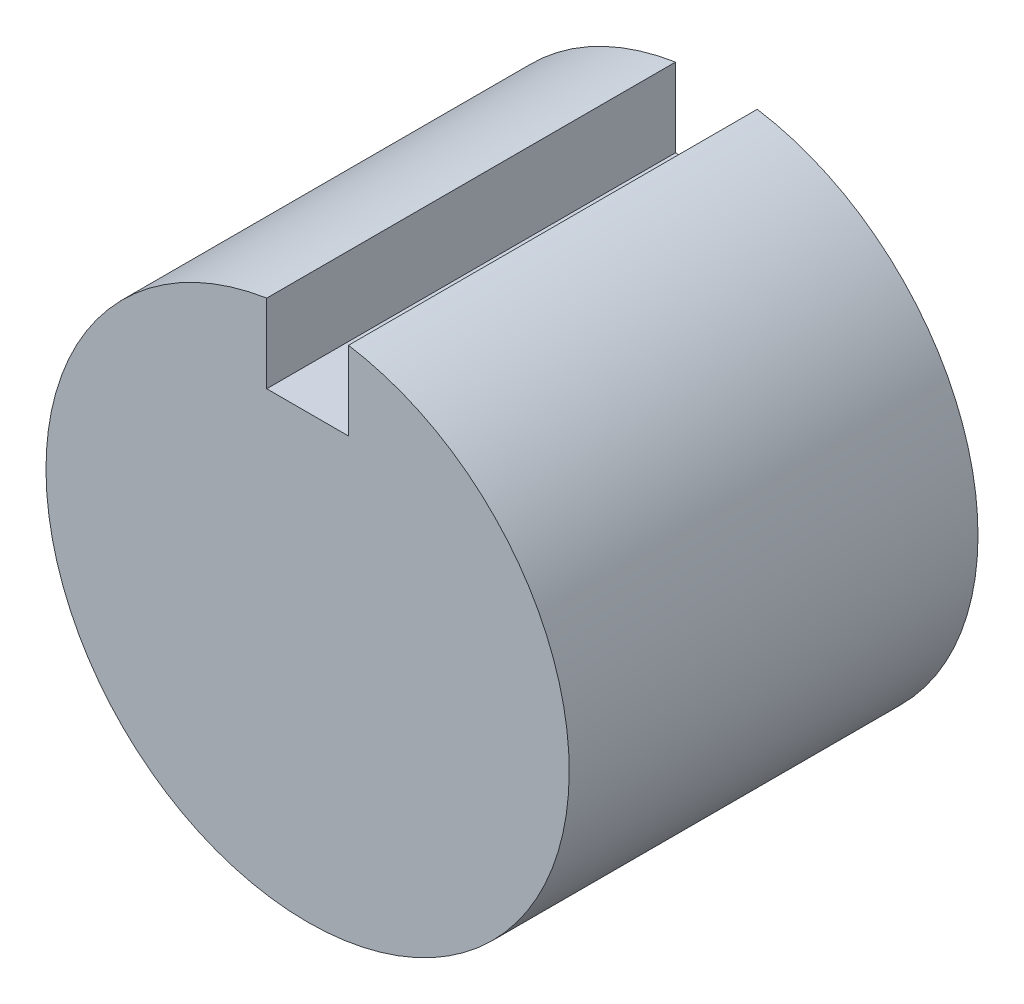
ISO-10303-21;
HEADER;
FILE_DESCRIPTION(('STEP AP214'),'2;1');
FILE_NAME('part.step','',(''),(''),'','','');
FILE_SCHEMA(('AUTOMOTIVE_DESIGN { 1 0 10303 214 1 1 1 1 }'));
ENDSEC;
DATA;
#1=APPLICATION_CONTEXT('core data for automotive mechanical design processes');
#2=APPLICATION_PROTOCOL_DEFINITION('international standard','automotive_design',2000,#1);
#3=PRODUCT_CONTEXT('',#1,'mechanical');
#4=PRODUCT('Part','Part','',(#3));
#5=PRODUCT_RELATED_PRODUCT_CATEGORY('part','',(#4));
#6=PRODUCT_DEFINITION_FORMATION('','',#4);
#7=PRODUCT_DEFINITION_CONTEXT('part definition',#1,'design');
#8=PRODUCT_DEFINITION('design','',#6,#7);
#9=PRODUCT_DEFINITION_SHAPE('','',#8);
#10=(LENGTH_UNIT() NAMED_UNIT(*) SI_UNIT(.MILLI.,.METRE.));
#11=(NAMED_UNIT(*) PLANE_ANGLE_UNIT() SI_UNIT($,.RADIAN.));
#12=(NAMED_UNIT(*) SI_UNIT($,.STERADIAN.) SOLID_ANGLE_UNIT());
#13=UNCERTAINTY_MEASURE_WITH_UNIT(LENGTH_MEASURE(1.E-05),#10,'distance_accuracy_value','');
#14=(GEOMETRIC_REPRESENTATION_CONTEXT(3) GLOBAL_UNCERTAINTY_ASSIGNED_CONTEXT((#13)) GLOBAL_UNIT_ASSIGNED_CONTEXT((#10,
#11,#12)) REPRESENTATION_CONTEXT('',''));
#15=CARTESIAN_POINT('',(0.,0.,0.));
#16=DIRECTION('',(0.,0.,1.));
#17=DIRECTION('',(1.,0.,0.));
#18=AXIS2_PLACEMENT_3D('',#15,#16,#17);
#19=CARTESIAN_POINT('',(0.,0.,10.));
#20=DIRECTION('',(0.,0.,-1.));
#21=DIRECTION('',(-1.,0.,0.));
#22=AXIS2_PLACEMENT_3D('',#19,#20,#21);
#23=CYLINDRICAL_SURFACE('',#22,6.4);
#24=DIRECTION('',(0.,0.,1.));
#25=VECTOR('',#24,1.);
#26=CARTESIAN_POINT('',(-1.,6.32139225171164,-38.3505319094211));
#27=LINE('',#26,#25);
#28=CARTESIAN_POINT('',(-1.,6.32139225171164,0.));
#29=VERTEX_POINT('',#28);
#30=CARTESIAN_POINT('',(-1.,6.32139225171164,10.));
#31=VERTEX_POINT('',#30);
#32=EDGE_CURVE('E91',#29,#31,#27,.T.);
#33=ORIENTED_EDGE('',*,*,#32,.F.);
#34=CARTESIAN_POINT('',(0.,0.,0.));
#35=DIRECTION('',(0.,0.,1.));
#36=DIRECTION('',(1.,0.,0.));
#37=AXIS2_PLACEMENT_3D('',#34,#35,#36);
#38=CIRCLE('',#37,6.4);
#39=CARTESIAN_POINT('',(1.,6.32139225171164,0.));
#40=VERTEX_POINT('',#39);
#41=EDGE_CURVE('E36',#29,#40,#38,.T.);
#42=ORIENTED_EDGE('',*,*,#41,.T.);
#43=DIRECTION('',(0.,0.,1.));
#44=VECTOR('',#43,1.);
#45=CARTESIAN_POINT('',(1.,6.32139225171164,-38.3505319094211));
#46=LINE('',#45,#44);
#47=CARTESIAN_POINT('',(1.,6.32139225171164,10.));
#48=VERTEX_POINT('',#47);
#49=EDGE_CURVE('E88',#40,#48,#46,.T.);
#50=ORIENTED_EDGE('',*,*,#49,.T.);
#51=CARTESIAN_POINT('',(0.,0.,10.));
#52=DIRECTION('',(0.,0.,1.));
#53=DIRECTION('',(1.,0.,0.));
#54=AXIS2_PLACEMENT_3D('',#51,#52,#53);
#55=CIRCLE('',#54,6.4);
#56=EDGE_CURVE('E11',#31,#48,#55,.T.);
#57=ORIENTED_EDGE('',*,*,#56,.F.);
#58=EDGE_LOOP('',(#33,#42,#50,#57));
#59=FACE_BOUND('',#58,.T.);
#60=ADVANCED_FACE('F33',(#59),#23,.T.);
#61=CARTESIAN_POINT('',(0.,0.,0.));
#62=DIRECTION('',(0.,0.,1.));
#63=DIRECTION('',(1.,0.,0.));
#64=AXIS2_PLACEMENT_3D('',#61,#62,#63);
#65=PLANE('',#64);
#66=DIRECTION('',(0.,-1.,0.));
#67=VECTOR('',#66,1.);
#68=CARTESIAN_POINT('',(-1.,4.4,0.));
#69=LINE('',#68,#67);
#70=CARTESIAN_POINT('',(-1.,4.4,0.));
#71=VERTEX_POINT('',#70);
#72=EDGE_CURVE('E77',#29,#71,#69,.T.);
#73=ORIENTED_EDGE('',*,*,#72,.T.);
#74=DIRECTION('',(1.,0.,0.));
#75=VECTOR('',#74,1.);
#76=CARTESIAN_POINT('',(-1.,4.4,0.));
#77=LINE('',#76,#75);
#78=CARTESIAN_POINT('',(1.,4.4,0.));
#79=VERTEX_POINT('',#78);
#80=EDGE_CURVE('E70',#71,#79,#77,.T.);
#81=ORIENTED_EDGE('',*,*,#80,.T.);
#82=DIRECTION('',(0.,1.,0.));
#83=VECTOR('',#82,1.);
#84=CARTESIAN_POINT('',(1.,4.4,0.));
#85=LINE('',#84,#83);
#86=EDGE_CURVE('E74',#79,#40,#85,.T.);
#87=ORIENTED_EDGE('',*,*,#86,.T.);
#88=ORIENTED_EDGE('',*,*,#41,.F.);
#89=EDGE_LOOP('',(#73,#81,#87,#88));
#90=FACE_BOUND('',#89,.T.);
#91=ADVANCED_FACE('F72',(#90),#65,.F.);
#92=CARTESIAN_POINT('',(0.,0.,10.));
#93=DIRECTION('',(0.,0.,1.));
#94=DIRECTION('',(1.,0.,0.));
#95=AXIS2_PLACEMENT_3D('',#92,#93,#94);
#96=PLANE('',#95);
#97=DIRECTION('',(0.,1.,0.));
#98=VECTOR('',#97,1.);
#99=CARTESIAN_POINT('',(1.,4.4,10.));
#100=LINE('',#99,#98);
#101=CARTESIAN_POINT('',(1.,4.4,9.99999999999999));
#102=VERTEX_POINT('',#101);
#103=EDGE_CURVE('E46',#102,#48,#100,.T.);
#104=ORIENTED_EDGE('',*,*,#103,.F.);
#105=DIRECTION('',(1.,0.,0.));
#106=VECTOR('',#105,1.);
#107=CARTESIAN_POINT('',(-1.,4.4,10.));
#108=LINE('',#107,#106);
#109=CARTESIAN_POINT('',(-1.,4.4,9.99999999999999));
#110=VERTEX_POINT('',#109);
#111=EDGE_CURVE('E50',#110,#102,#108,.T.);
#112=ORIENTED_EDGE('',*,*,#111,.F.);
#113=DIRECTION('',(0.,-1.,0.));
#114=VECTOR('',#113,1.);
#115=CARTESIAN_POINT('',(-1.,4.4,10.));
#116=LINE('',#115,#114);
#117=EDGE_CURVE('E96',#31,#110,#116,.T.);
#118=ORIENTED_EDGE('',*,*,#117,.F.);
#119=ORIENTED_EDGE('',*,*,#56,.T.);
#120=EDGE_LOOP('',(#104,#112,#118,#119));
#121=FACE_BOUND('',#120,.T.);
#122=ADVANCED_FACE('F107',(#121),#96,.T.);
#123=CARTESIAN_POINT('',(-1.,4.4,-38.3505319094211));
#124=DIRECTION('',(1.,0.,0.));
#125=DIRECTION('',(0.,0.,-1.));
#126=AXIS2_PLACEMENT_3D('',#123,#124,#125);
#127=PLANE('',#126);
#128=ORIENTED_EDGE('',*,*,#72,.F.);
#129=ORIENTED_EDGE('',*,*,#32,.T.);
#130=ORIENTED_EDGE('',*,*,#117,.T.);
#131=DIRECTION('',(0.,0.,1.));
#132=VECTOR('',#131,1.);
#133=CARTESIAN_POINT('',(-1.,4.4,-38.3505319094211));
#134=LINE('',#133,#132);
#135=EDGE_CURVE('E94',#71,#110,#134,.T.);
#136=ORIENTED_EDGE('',*,*,#135,.F.);
#137=EDGE_LOOP('',(#128,#129,#130,#136));
#138=FACE_BOUND('',#137,.T.);
#139=ADVANCED_FACE('F102',(#138),#127,.T.);
#140=CARTESIAN_POINT('',(-1.,4.4,-38.3505319094211));
#141=DIRECTION('',(0.,1.,0.));
#142=DIRECTION('',(-1.,0.,0.));
#143=AXIS2_PLACEMENT_3D('',#140,#141,#142);
#144=PLANE('',#143);
#145=ORIENTED_EDGE('',*,*,#80,.F.);
#146=ORIENTED_EDGE('',*,*,#135,.T.);
#147=ORIENTED_EDGE('',*,*,#111,.T.);
#148=DIRECTION('',(0.,0.,1.));
#149=VECTOR('',#148,1.);
#150=CARTESIAN_POINT('',(1.,4.4,-38.3505319094211));
#151=LINE('',#150,#149);
#152=EDGE_CURVE('E87',#79,#102,#151,.T.);
#153=ORIENTED_EDGE('',*,*,#152,.F.);
#154=EDGE_LOOP('',(#145,#146,#147,#153));
#155=FACE_BOUND('',#154,.T.);
#156=ADVANCED_FACE('F90',(#155),#144,.T.);
#157=CARTESIAN_POINT('',(1.,4.4,-38.3505319094211));
#158=DIRECTION('',(-1.,0.,0.));
#159=DIRECTION('',(0.,0.,1.));
#160=AXIS2_PLACEMENT_3D('',#157,#158,#159);
#161=PLANE('',#160);
#162=ORIENTED_EDGE('',*,*,#86,.F.);
#163=ORIENTED_EDGE('',*,*,#152,.T.);
#164=ORIENTED_EDGE('',*,*,#103,.T.);
#165=ORIENTED_EDGE('',*,*,#49,.F.);
#166=EDGE_LOOP('',(#162,#163,#164,#165));
#167=FACE_BOUND('',#166,.T.);
#168=ADVANCED_FACE('F86',(#167),#161,.T.);
#169=CLOSED_SHELL('',(#60,#91,#122,#139,#156,#168));
#170=MANIFOLD_SOLID_BREP('B2',#169);
#171=ADVANCED_BREP_SHAPE_REPRESENTATION('',(#18,#170),#14);
#172=SHAPE_DEFINITION_REPRESENTATION(#9,#171);
ENDSEC;
END-ISO-10303-21;
